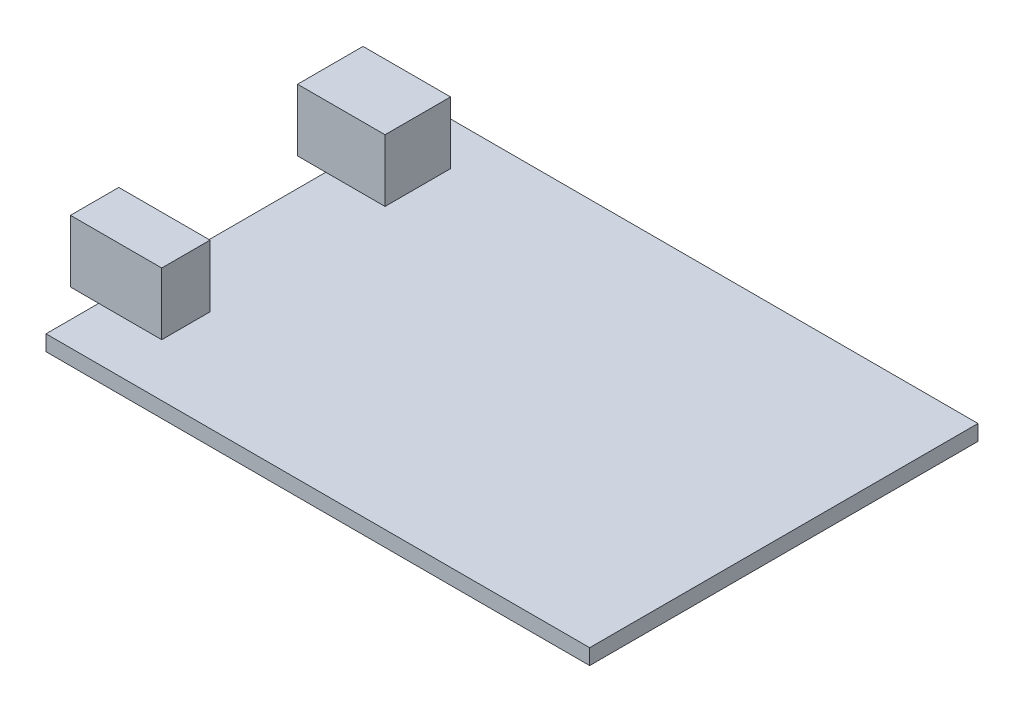
ISO-10303-21;
HEADER;
FILE_DESCRIPTION(('STEP AP214'),'2;1');
FILE_NAME('part.step','',(''),(''),'','','');
FILE_SCHEMA(('AUTOMOTIVE_DESIGN { 1 0 10303 214 1 1 1 1 }'));
ENDSEC;
DATA;
#1=APPLICATION_CONTEXT('core data for automotive mechanical design processes');
#2=APPLICATION_PROTOCOL_DEFINITION('international standard','automotive_design',2000,#1);
#3=PRODUCT_CONTEXT('',#1,'mechanical');
#4=PRODUCT('Part','Part','',(#3));
#5=PRODUCT_RELATED_PRODUCT_CATEGORY('part','',(#4));
#6=PRODUCT_DEFINITION_FORMATION('','',#4);
#7=PRODUCT_DEFINITION_CONTEXT('part definition',#1,'design');
#8=PRODUCT_DEFINITION('design','',#6,#7);
#9=PRODUCT_DEFINITION_SHAPE('','',#8);
#10=(LENGTH_UNIT() NAMED_UNIT(*) SI_UNIT(.MILLI.,.METRE.));
#11=(NAMED_UNIT(*) PLANE_ANGLE_UNIT() SI_UNIT($,.RADIAN.));
#12=(NAMED_UNIT(*) SI_UNIT($,.STERADIAN.) SOLID_ANGLE_UNIT());
#13=UNCERTAINTY_MEASURE_WITH_UNIT(LENGTH_MEASURE(1.E-05),#10,'distance_accuracy_value','');
#14=(GEOMETRIC_REPRESENTATION_CONTEXT(3) GLOBAL_UNCERTAINTY_ASSIGNED_CONTEXT((#13)) GLOBAL_UNIT_ASSIGNED_CONTEXT((#10,
#11,#12)) REPRESENTATION_CONTEXT('',''));
#15=CARTESIAN_POINT('',(0.,0.,0.));
#16=DIRECTION('',(0.,0.,1.));
#17=DIRECTION('',(1.,0.,0.));
#18=AXIS2_PLACEMENT_3D('',#15,#16,#17);
#19=CARTESIAN_POINT('',(0.,2.,0.));
#20=DIRECTION('',(0.,1.,0.));
#21=DIRECTION('',(0.,0.,1.));
#22=AXIS2_PLACEMENT_3D('',#19,#20,#21);
#23=PLANE('',#22);
#24=DIRECTION('',(0.,0.,-1.));
#25=VECTOR('',#24,1.);
#26=CARTESIAN_POINT('',(-14.1859712994656,2.,27.3935905930048));
#27=LINE('',#26,#25);
#28=CARTESIAN_POINT('',(-14.1859712994656,2.,33.6141875318112));
#29=VERTEX_POINT('',#28);
#30=CARTESIAN_POINT('',(-14.1859712994656,2.,27.3935905930048));
#31=VERTEX_POINT('',#30);
#32=EDGE_CURVE('E312',#29,#31,#27,.T.);
#33=ORIENTED_EDGE('',*,*,#32,.F.);
#34=DIRECTION('',(-1.,0.,0.));
#35=VECTOR('',#34,1.);
#36=CARTESIAN_POINT('',(0.,2.,33.6141875318112));
#37=LINE('',#36,#35);
#38=CARTESIAN_POINT('',(-22.2991689750693,2.,33.6141875318112));
#39=VERTEX_POINT('',#38);
#40=EDGE_CURVE('E11',#29,#39,#37,.T.);
#41=ORIENTED_EDGE('',*,*,#40,.T.);
#42=DIRECTION('',(0.,0.,1.));
#43=VECTOR('',#42,1.);
#44=CARTESIAN_POINT('',(-22.2991689750693,2.,-9.59833795013851));
#45=LINE('',#44,#43);
#46=CARTESIAN_POINT('',(-22.2991689750693,2.,40.4016620498615));
#47=VERTEX_POINT('',#46);
#48=EDGE_CURVE('E387',#39,#47,#45,.T.);
#49=ORIENTED_EDGE('',*,*,#48,.T.);
#50=DIRECTION('',(1.,0.,0.));
#51=VECTOR('',#50,1.);
#52=CARTESIAN_POINT('',(-22.2991689750693,2.,40.4016620498615));
#53=LINE('',#52,#51);
#54=CARTESIAN_POINT('',(47.7008310249307,2.,40.4016620498615));
#55=VERTEX_POINT('',#54);
#56=EDGE_CURVE('E385',#47,#55,#53,.T.);
#57=ORIENTED_EDGE('',*,*,#56,.T.);
#58=DIRECTION('',(0.,0.,-1.));
#59=VECTOR('',#58,1.);
#60=CARTESIAN_POINT('',(47.7008310249307,2.,-9.59833795013851));
#61=LINE('',#60,#59);
#62=CARTESIAN_POINT('',(47.7008310249307,2.,-9.59833795013851));
#63=VERTEX_POINT('',#62);
#64=EDGE_CURVE('E390',#55,#63,#61,.T.);
#65=ORIENTED_EDGE('',*,*,#64,.T.);
#66=DIRECTION('',(-1.,0.,0.));
#67=VECTOR('',#66,1.);
#68=CARTESIAN_POINT('',(-22.2991689750693,2.,-9.59833795013851));
#69=LINE('',#68,#67);
#70=CARTESIAN_POINT('',(-22.2991689750693,2.,-9.59833795013851));
#71=VERTEX_POINT('',#70);
#72=EDGE_CURVE('E393',#63,#71,#69,.T.);
#73=ORIENTED_EDGE('',*,*,#72,.T.);
#74=CARTESIAN_POINT('',(-22.2991689750693,2.,-4.05498281984949));
#75=VERTEX_POINT('',#74);
#76=EDGE_CURVE('E381',#71,#75,#45,.T.);
#77=ORIENTED_EDGE('',*,*,#76,.T.);
#78=DIRECTION('',(-1.,0.,0.));
#79=VECTOR('',#78,1.);
#80=CARTESIAN_POINT('',(-25.9359877394331,2.,-4.05498281984949));
#81=LINE('',#80,#79);
#82=CARTESIAN_POINT('',(-14.6697955058172,2.,-4.05498281984949));
#83=VERTEX_POINT('',#82);
#84=EDGE_CURVE('E340',#83,#75,#81,.T.);
#85=ORIENTED_EDGE('',*,*,#84,.F.);
#86=DIRECTION('',(0.,0.,-1.));
#87=VECTOR('',#86,1.);
#88=CARTESIAN_POINT('',(-14.6697955058172,2.,-4.05498281984949));
#89=LINE('',#88,#87);
#90=CARTESIAN_POINT('',(-14.6697955058172,2.,4.37738191942134));
#91=VERTEX_POINT('',#90);
#92=EDGE_CURVE('E357',#91,#83,#89,.T.);
#93=ORIENTED_EDGE('',*,*,#92,.F.);
#94=DIRECTION('',(1.,0.,0.));
#95=VECTOR('',#94,1.);
#96=CARTESIAN_POINT('',(-25.9359877394331,2.,4.37738191942134));
#97=LINE('',#96,#95);
#98=CARTESIAN_POINT('',(-22.2991689750693,2.,4.37738191942134));
#99=VERTEX_POINT('',#98);
#100=EDGE_CURVE('E48',#99,#91,#97,.T.);
#101=ORIENTED_EDGE('',*,*,#100,.F.);
#102=CARTESIAN_POINT('',(-22.2991689750693,2.,27.3935905930048));
#103=VERTEX_POINT('',#102);
#104=EDGE_CURVE('E453',#99,#103,#45,.T.);
#105=ORIENTED_EDGE('',*,*,#104,.T.);
#106=DIRECTION('',(-1.,0.,0.));
#107=VECTOR('',#106,1.);
#108=CARTESIAN_POINT('',(-25.9359877394331,2.,27.3935905930048));
#109=LINE('',#108,#107);
#110=EDGE_CURVE('E295',#31,#103,#109,.T.);
#111=ORIENTED_EDGE('',*,*,#110,.F.);
#112=EDGE_LOOP('',(#33,#41,#49,#57,#65,#73,#77,#85,#93,#101,#105,#111));
#113=FACE_BOUND('',#112,.T.);
#114=ADVANCED_FACE('F39',(#113),#23,.T.);
#115=CARTESIAN_POINT('',(-22.2991689750693,2.,-9.59833795013851));
#116=DIRECTION('',(1.,0.,0.));
#117=DIRECTION('',(0.,0.,-1.));
#118=AXIS2_PLACEMENT_3D('',#115,#116,#117);
#119=PLANE('',#118);
#120=DIRECTION('',(0.,0.,1.));
#121=VECTOR('',#120,1.);
#122=CARTESIAN_POINT('',(-22.2991689750693,0.,-9.59833795013851));
#123=LINE('',#122,#121);
#124=CARTESIAN_POINT('',(-22.2991689750693,0.,-9.59833795013851));
#125=VERTEX_POINT('',#124);
#126=CARTESIAN_POINT('',(-22.2991689750693,0.,40.4016620498615));
#127=VERTEX_POINT('',#126);
#128=EDGE_CURVE('E380',#125,#127,#123,.T.);
#129=ORIENTED_EDGE('',*,*,#128,.T.);
#130=DIRECTION('',(0.,-1.,0.));
#131=VECTOR('',#130,1.);
#132=CARTESIAN_POINT('',(-22.2991689750693,2.,40.4016620498615));
#133=LINE('',#132,#131);
#134=EDGE_CURVE('E419',#47,#127,#133,.T.);
#135=ORIENTED_EDGE('',*,*,#134,.F.);
#136=ORIENTED_EDGE('',*,*,#48,.F.);
#137=EDGE_CURVE('E455',#103,#39,#45,.T.);
#138=ORIENTED_EDGE('',*,*,#137,.F.);
#139=ORIENTED_EDGE('',*,*,#104,.F.);
#140=EDGE_CURVE('E386',#75,#99,#45,.T.);
#141=ORIENTED_EDGE('',*,*,#140,.F.);
#142=ORIENTED_EDGE('',*,*,#76,.F.);
#143=DIRECTION('',(0.,-1.,0.));
#144=VECTOR('',#143,1.);
#145=CARTESIAN_POINT('',(-22.2991689750693,2.,-9.59833795013851));
#146=LINE('',#145,#144);
#147=EDGE_CURVE('E396',#71,#125,#146,.T.);
#148=ORIENTED_EDGE('',*,*,#147,.T.);
#149=EDGE_LOOP('',(#129,#135,#136,#138,#139,#141,#142,#148));
#150=FACE_BOUND('',#149,.T.);
#151=ADVANCED_FACE('F41',(#150),#119,.F.);
#152=CARTESIAN_POINT('',(-22.2991689750693,2.,40.4016620498615));
#153=DIRECTION('',(0.,0.,-1.));
#154=DIRECTION('',(-1.,0.,0.));
#155=AXIS2_PLACEMENT_3D('',#152,#153,#154);
#156=PLANE('',#155);
#157=DIRECTION('',(1.,0.,0.));
#158=VECTOR('',#157,1.);
#159=CARTESIAN_POINT('',(-22.2991689750693,0.,40.4016620498615));
#160=LINE('',#159,#158);
#161=CARTESIAN_POINT('',(47.7008310249307,0.,40.4016620498615));
#162=VERTEX_POINT('',#161);
#163=EDGE_CURVE('E400',#127,#162,#160,.T.);
#164=ORIENTED_EDGE('',*,*,#163,.T.);
#165=DIRECTION('',(0.,-1.,0.));
#166=VECTOR('',#165,1.);
#167=CARTESIAN_POINT('',(47.7008310249307,2.,40.4016620498615));
#168=LINE('',#167,#166);
#169=EDGE_CURVE('E416',#55,#162,#168,.T.);
#170=ORIENTED_EDGE('',*,*,#169,.F.);
#171=ORIENTED_EDGE('',*,*,#56,.F.);
#172=ORIENTED_EDGE('',*,*,#134,.T.);
#173=EDGE_LOOP('',(#164,#170,#171,#172));
#174=FACE_BOUND('',#173,.T.);
#175=ADVANCED_FACE('F464',(#174),#156,.F.);
#176=CARTESIAN_POINT('',(47.7008310249307,2.,-9.59833795013851));
#177=DIRECTION('',(-1.,0.,0.));
#178=DIRECTION('',(0.,0.,1.));
#179=AXIS2_PLACEMENT_3D('',#176,#177,#178);
#180=PLANE('',#179);
#181=DIRECTION('',(0.,0.,-1.));
#182=VECTOR('',#181,1.);
#183=CARTESIAN_POINT('',(47.7008310249307,0.,-9.59833795013851));
#184=LINE('',#183,#182);
#185=CARTESIAN_POINT('',(47.7008310249307,0.,-9.59833795013851));
#186=VERTEX_POINT('',#185);
#187=EDGE_CURVE('E403',#162,#186,#184,.T.);
#188=ORIENTED_EDGE('',*,*,#187,.T.);
#189=DIRECTION('',(0.,-1.,0.));
#190=VECTOR('',#189,1.);
#191=CARTESIAN_POINT('',(47.7008310249307,2.,-9.59833795013851));
#192=LINE('',#191,#190);
#193=EDGE_CURVE('E412',#63,#186,#192,.T.);
#194=ORIENTED_EDGE('',*,*,#193,.F.);
#195=ORIENTED_EDGE('',*,*,#64,.F.);
#196=ORIENTED_EDGE('',*,*,#169,.T.);
#197=EDGE_LOOP('',(#188,#194,#195,#196));
#198=FACE_BOUND('',#197,.T.);
#199=ADVANCED_FACE('F473',(#198),#180,.F.);
#200=CARTESIAN_POINT('',(-22.2991689750693,2.,-9.59833795013851));
#201=DIRECTION('',(0.,0.,1.));
#202=DIRECTION('',(1.,0.,0.));
#203=AXIS2_PLACEMENT_3D('',#200,#201,#202);
#204=PLANE('',#203);
#205=DIRECTION('',(-1.,0.,0.));
#206=VECTOR('',#205,1.);
#207=CARTESIAN_POINT('',(-22.2991689750693,0.,-9.59833795013851));
#208=LINE('',#207,#206);
#209=EDGE_CURVE('E406',#186,#125,#208,.T.);
#210=ORIENTED_EDGE('',*,*,#209,.T.);
#211=ORIENTED_EDGE('',*,*,#147,.F.);
#212=ORIENTED_EDGE('',*,*,#72,.F.);
#213=ORIENTED_EDGE('',*,*,#193,.T.);
#214=EDGE_LOOP('',(#210,#211,#212,#213));
#215=FACE_BOUND('',#214,.T.);
#216=ADVANCED_FACE('F477',(#215),#204,.F.);
#217=CARTESIAN_POINT('',(0.,0.,0.));
#218=DIRECTION('',(0.,1.,0.));
#219=DIRECTION('',(0.,0.,1.));
#220=AXIS2_PLACEMENT_3D('',#217,#218,#219);
#221=PLANE('',#220);
#222=ORIENTED_EDGE('',*,*,#128,.F.);
#223=ORIENTED_EDGE('',*,*,#209,.F.);
#224=ORIENTED_EDGE('',*,*,#187,.F.);
#225=ORIENTED_EDGE('',*,*,#163,.F.);
#226=EDGE_LOOP('',(#222,#223,#224,#225));
#227=FACE_BOUND('',#226,.T.);
#228=ADVANCED_FACE('F470',(#227),#221,.F.);
#229=CARTESIAN_POINT('',(0.,2.,0.));
#230=DIRECTION('',(0.,1.,0.));
#231=DIRECTION('',(0.,0.,1.));
#232=AXIS2_PLACEMENT_3D('',#229,#230,#231);
#233=PLANE('',#232);
#234=CARTESIAN_POINT('',(-25.9359877394331,2.,-4.05498281984949));
#235=VERTEX_POINT('',#234);
#236=EDGE_CURVE('E361',#75,#235,#81,.T.);
#237=ORIENTED_EDGE('',*,*,#236,.F.);
#238=ORIENTED_EDGE('',*,*,#140,.T.);
#239=CARTESIAN_POINT('',(-25.9359877394331,2.,4.37738191942134));
#240=VERTEX_POINT('',#239);
#241=EDGE_CURVE('E353',#240,#99,#97,.T.);
#242=ORIENTED_EDGE('',*,*,#241,.F.);
#243=DIRECTION('',(0.,0.,1.));
#244=VECTOR('',#243,1.);
#245=CARTESIAN_POINT('',(-25.9359877394331,2.,-4.05498281984949));
#246=LINE('',#245,#244);
#247=EDGE_CURVE('E334',#235,#240,#246,.T.);
#248=ORIENTED_EDGE('',*,*,#247,.F.);
#249=EDGE_LOOP('',(#237,#238,#242,#248));
#250=FACE_BOUND('',#249,.T.);
#251=ADVANCED_FACE('F448',(#250),#233,.F.);
#252=CARTESIAN_POINT('',(-25.9359877394331,10.,-4.05498281984949));
#253=DIRECTION('',(1.,0.,0.));
#254=DIRECTION('',(0.,0.,-1.));
#255=AXIS2_PLACEMENT_3D('',#252,#253,#254);
#256=PLANE('',#255);
#257=DIRECTION('',(0.,0.,1.));
#258=VECTOR('',#257,1.);
#259=CARTESIAN_POINT('',(-25.9359877394331,6.72634302600983,-2.56591012597696));
#260=LINE('',#259,#258);
#261=CARTESIAN_POINT('',(-25.9359877394331,6.72634302600983,-2.56591012597696));
#262=VERTEX_POINT('',#261);
#263=CARTESIAN_POINT('',(-25.9359877394331,6.72634302600983,3.40255310465132));
#264=VERTEX_POINT('',#263);
#265=EDGE_CURVE('E225',#262,#264,#260,.T.);
#266=ORIENTED_EDGE('',*,*,#265,.F.);
#267=DIRECTION('',(0.,-1.,0.));
#268=VECTOR('',#267,1.);
#269=CARTESIAN_POINT('',(-25.9359877394331,6.72634302600983,-2.56591012597696));
#270=LINE('',#269,#268);
#271=CARTESIAN_POINT('',(-25.9359877394331,8.4983750083083,-2.56591012597696));
#272=VERTEX_POINT('',#271);
#273=EDGE_CURVE('E55',#272,#262,#270,.T.);
#274=ORIENTED_EDGE('',*,*,#273,.F.);
#275=DIRECTION('',(0.,0.,-1.));
#276=VECTOR('',#275,1.);
#277=CARTESIAN_POINT('',(-25.9359877394331,8.4983750083083,-2.56591012597696));
#278=LINE('',#277,#276);
#279=CARTESIAN_POINT('',(-25.9359877394331,8.4983750083083,3.40255310465132));
#280=VERTEX_POINT('',#279);
#281=EDGE_CURVE('E212',#280,#272,#278,.T.);
#282=ORIENTED_EDGE('',*,*,#281,.F.);
#283=DIRECTION('',(0.,1.,0.));
#284=VECTOR('',#283,1.);
#285=CARTESIAN_POINT('',(-25.9359877394331,6.72634302600983,3.40255310465132));
#286=LINE('',#285,#284);
#287=EDGE_CURVE('E216',#264,#280,#286,.T.);
#288=ORIENTED_EDGE('',*,*,#287,.F.);
#289=EDGE_LOOP('',(#266,#274,#282,#288));
#290=FACE_BOUND('',#289,.T.);
#291=DIRECTION('',(0.,0.,1.));
#292=VECTOR('',#291,1.);
#293=CARTESIAN_POINT('',(-25.9359877394331,3.59236327771129,-2.56591012597696));
#294=LINE('',#293,#292);
#295=CARTESIAN_POINT('',(-25.9359877394331,3.59236327771129,-2.56591012597696));
#296=VERTEX_POINT('',#295);
#297=CARTESIAN_POINT('',(-25.9359877394331,3.59236327771129,3.40255310465132));
#298=VERTEX_POINT('',#297);
#299=EDGE_CURVE('E267',#296,#298,#294,.T.);
#300=ORIENTED_EDGE('',*,*,#299,.F.);
#301=DIRECTION('',(0.,-1.,0.));
#302=VECTOR('',#301,1.);
#303=CARTESIAN_POINT('',(-25.9359877394331,3.59236327771129,-2.56591012597696));
#304=LINE('',#303,#302);
#305=CARTESIAN_POINT('',(-25.9359877394331,5.55405328059067,-2.56591012597696));
#306=VERTEX_POINT('',#305);
#307=EDGE_CURVE('E63',#306,#296,#304,.T.);
#308=ORIENTED_EDGE('',*,*,#307,.F.);
#309=DIRECTION('',(0.,0.,-1.));
#310=VECTOR('',#309,1.);
#311=CARTESIAN_POINT('',(-25.9359877394331,5.55405328059067,-2.56591012597696));
#312=LINE('',#311,#310);
#313=CARTESIAN_POINT('',(-25.9359877394331,5.55405328059067,3.40255310465132));
#314=VERTEX_POINT('',#313);
#315=EDGE_CURVE('E252',#314,#306,#312,.T.);
#316=ORIENTED_EDGE('',*,*,#315,.F.);
#317=DIRECTION('',(0.,1.,0.));
#318=VECTOR('',#317,1.);
#319=CARTESIAN_POINT('',(-25.9359877394331,3.59236327771129,3.40255310465132));
#320=LINE('',#319,#318);
#321=EDGE_CURVE('E271',#298,#314,#320,.T.);
#322=ORIENTED_EDGE('',*,*,#321,.F.);
#323=EDGE_LOOP('',(#300,#308,#316,#322));
#324=FACE_BOUND('',#323,.T.);
#325=ORIENTED_EDGE('',*,*,#247,.T.);
#326=DIRECTION('',(0.,-1.,0.));
#327=VECTOR('',#326,1.);
#328=CARTESIAN_POINT('',(-25.9359877394331,10.,4.37738191942134));
#329=LINE('',#328,#327);
#330=CARTESIAN_POINT('',(-25.9359877394331,10.,4.37738191942134));
#331=VERTEX_POINT('',#330);
#332=EDGE_CURVE('E376',#331,#240,#329,.T.);
#333=ORIENTED_EDGE('',*,*,#332,.F.);
#334=DIRECTION('',(0.,0.,1.));
#335=VECTOR('',#334,1.);
#336=CARTESIAN_POINT('',(-25.9359877394331,10.,-4.05498281984949));
#337=LINE('',#336,#335);
#338=CARTESIAN_POINT('',(-25.9359877394331,10.,-4.05498281984949));
#339=VERTEX_POINT('',#338);
#340=EDGE_CURVE('E335',#339,#331,#337,.T.);
#341=ORIENTED_EDGE('',*,*,#340,.F.);
#342=DIRECTION('',(0.,-1.,0.));
#343=VECTOR('',#342,1.);
#344=CARTESIAN_POINT('',(-25.9359877394331,10.,-4.05498281984949));
#345=LINE('',#344,#343);
#346=EDGE_CURVE('E349',#339,#235,#345,.T.);
#347=ORIENTED_EDGE('',*,*,#346,.T.);
#348=EDGE_LOOP('',(#325,#333,#341,#347));
#349=FACE_BOUND('',#348,.T.);
#350=ADVANCED_FACE('F445',(#290,#324,#349),#256,.F.);
#351=CARTESIAN_POINT('',(-25.9359877394331,10.,4.37738191942134));
#352=DIRECTION('',(0.,0.,-1.));
#353=DIRECTION('',(-1.,0.,0.));
#354=AXIS2_PLACEMENT_3D('',#351,#352,#353);
#355=PLANE('',#354);
#356=ORIENTED_EDGE('',*,*,#241,.T.);
#357=ORIENTED_EDGE('',*,*,#100,.T.);
#358=DIRECTION('',(0.,-1.,0.));
#359=VECTOR('',#358,1.);
#360=CARTESIAN_POINT('',(-14.6697955058172,10.,4.37738191942134));
#361=LINE('',#360,#359);
#362=CARTESIAN_POINT('',(-14.6697955058172,10.,4.37738191942134));
#363=VERTEX_POINT('',#362);
#364=EDGE_CURVE('E372',#363,#91,#361,.T.);
#365=ORIENTED_EDGE('',*,*,#364,.F.);
#366=DIRECTION('',(1.,0.,0.));
#367=VECTOR('',#366,1.);
#368=CARTESIAN_POINT('',(-25.9359877394331,10.,4.37738191942134));
#369=LINE('',#368,#367);
#370=EDGE_CURVE('E339',#331,#363,#369,.T.);
#371=ORIENTED_EDGE('',*,*,#370,.F.);
#372=ORIENTED_EDGE('',*,*,#332,.T.);
#373=EDGE_LOOP('',(#356,#357,#365,#371,#372));
#374=FACE_BOUND('',#373,.T.);
#375=ADVANCED_FACE('F429',(#374),#355,.F.);
#376=CARTESIAN_POINT('',(-14.6697955058172,10.,-4.05498281984949));
#377=DIRECTION('',(-1.,0.,0.));
#378=DIRECTION('',(0.,0.,1.));
#379=AXIS2_PLACEMENT_3D('',#376,#377,#378);
#380=PLANE('',#379);
#381=ORIENTED_EDGE('',*,*,#92,.T.);
#382=DIRECTION('',(0.,-1.,0.));
#383=VECTOR('',#382,1.);
#384=CARTESIAN_POINT('',(-14.6697955058172,10.,-4.05498281984949));
#385=LINE('',#384,#383);
#386=CARTESIAN_POINT('',(-14.6697955058172,10.,-4.05498281984949));
#387=VERTEX_POINT('',#386);
#388=EDGE_CURVE('E368',#387,#83,#385,.T.);
#389=ORIENTED_EDGE('',*,*,#388,.F.);
#390=DIRECTION('',(0.,0.,-1.));
#391=VECTOR('',#390,1.);
#392=CARTESIAN_POINT('',(-14.6697955058172,10.,-4.05498281984949));
#393=LINE('',#392,#391);
#394=EDGE_CURVE('E343',#363,#387,#393,.T.);
#395=ORIENTED_EDGE('',*,*,#394,.F.);
#396=ORIENTED_EDGE('',*,*,#364,.T.);
#397=EDGE_LOOP('',(#381,#389,#395,#396));
#398=FACE_BOUND('',#397,.T.);
#399=ADVANCED_FACE('F435',(#398),#380,.F.);
#400=CARTESIAN_POINT('',(-25.9359877394331,10.,-4.05498281984949));
#401=DIRECTION('',(0.,0.,1.));
#402=DIRECTION('',(1.,0.,0.));
#403=AXIS2_PLACEMENT_3D('',#400,#401,#402);
#404=PLANE('',#403);
#405=ORIENTED_EDGE('',*,*,#84,.T.);
#406=ORIENTED_EDGE('',*,*,#236,.T.);
#407=ORIENTED_EDGE('',*,*,#346,.F.);
#408=DIRECTION('',(-1.,0.,0.));
#409=VECTOR('',#408,1.);
#410=CARTESIAN_POINT('',(-25.9359877394331,10.,-4.05498281984949));
#411=LINE('',#410,#409);
#412=EDGE_CURVE('E346',#387,#339,#411,.T.);
#413=ORIENTED_EDGE('',*,*,#412,.F.);
#414=ORIENTED_EDGE('',*,*,#388,.T.);
#415=EDGE_LOOP('',(#405,#406,#407,#413,#414));
#416=FACE_BOUND('',#415,.T.);
#417=ADVANCED_FACE('F500',(#416),#404,.F.);
#418=CARTESIAN_POINT('',(0.,10.,0.));
#419=DIRECTION('',(0.,1.,0.));
#420=DIRECTION('',(0.,0.,1.));
#421=AXIS2_PLACEMENT_3D('',#418,#419,#420);
#422=PLANE('',#421);
#423=ORIENTED_EDGE('',*,*,#340,.T.);
#424=ORIENTED_EDGE('',*,*,#370,.T.);
#425=ORIENTED_EDGE('',*,*,#394,.T.);
#426=ORIENTED_EDGE('',*,*,#412,.T.);
#427=EDGE_LOOP('',(#423,#424,#425,#426));
#428=FACE_BOUND('',#427,.T.);
#429=ADVANCED_FACE('F439',(#428),#422,.T.);
#430=CARTESIAN_POINT('',(0.,2.,0.));
#431=DIRECTION('',(0.,1.,0.));
#432=DIRECTION('',(0.,0.,1.));
#433=AXIS2_PLACEMENT_3D('',#430,#431,#432);
#434=PLANE('',#433);
#435=CARTESIAN_POINT('',(-25.9359877394331,2.,27.3935905930048));
#436=VERTEX_POINT('',#435);
#437=EDGE_CURVE('E316',#103,#436,#109,.T.);
#438=ORIENTED_EDGE('',*,*,#437,.F.);
#439=ORIENTED_EDGE('',*,*,#137,.T.);
#440=DIRECTION('',(1.,0.,0.));
#441=VECTOR('',#440,1.);
#442=CARTESIAN_POINT('',(-25.9359877394331,2.,33.6141875318112));
#443=LINE('',#442,#441);
#444=CARTESIAN_POINT('',(-25.9359877394331,2.,33.6141875318112));
#445=VERTEX_POINT('',#444);
#446=EDGE_CURVE('E308',#445,#39,#443,.T.);
#447=ORIENTED_EDGE('',*,*,#446,.F.);
#448=DIRECTION('',(0.,0.,1.));
#449=VECTOR('',#448,1.);
#450=CARTESIAN_POINT('',(-25.9359877394331,2.,27.3935905930048));
#451=LINE('',#450,#449);
#452=EDGE_CURVE('E281',#436,#445,#451,.T.);
#453=ORIENTED_EDGE('',*,*,#452,.F.);
#454=EDGE_LOOP('',(#438,#439,#447,#453));
#455=FACE_BOUND('',#454,.T.);
#456=ADVANCED_FACE('F508',(#455),#434,.F.);
#457=CARTESIAN_POINT('',(-25.9359877394331,10.,27.3935905930048));
#458=DIRECTION('',(1.,0.,0.));
#459=DIRECTION('',(0.,0.,-1.));
#460=AXIS2_PLACEMENT_3D('',#457,#458,#459);
#461=PLANE('',#460);
#462=CARTESIAN_POINT('',(-25.9359877394331,5.55405328059067,30.5003001079012));
#463=DIRECTION('',(-1.,0.,0.));
#464=DIRECTION('',(0.,0.,1.));
#465=AXIS2_PLACEMENT_3D('',#462,#463,#464);
#466=CIRCLE('',#465,2.07325927731412);
#467=CARTESIAN_POINT('',(-25.9359877394331,5.55405328059067,32.5735593852153));
#468=VERTEX_POINT('',#467);
#469=EDGE_CURVE('E243',#468,#468,#466,.T.);
#470=ORIENTED_EDGE('',*,*,#469,.F.);
#471=EDGE_LOOP('',(#470));
#472=FACE_BOUND('',#471,.T.);
#473=ORIENTED_EDGE('',*,*,#452,.T.);
#474=DIRECTION('',(0.,-1.,0.));
#475=VECTOR('',#474,1.);
#476=CARTESIAN_POINT('',(-25.9359877394331,10.,33.6141875318112));
#477=LINE('',#476,#475);
#478=CARTESIAN_POINT('',(-25.9359877394331,10.,33.6141875318112));
#479=VERTEX_POINT('',#478);
#480=EDGE_CURVE('E330',#479,#445,#477,.T.);
#481=ORIENTED_EDGE('',*,*,#480,.F.);
#482=DIRECTION('',(0.,0.,1.));
#483=VECTOR('',#482,1.);
#484=CARTESIAN_POINT('',(-25.9359877394331,10.,27.3935905930048));
#485=LINE('',#484,#483);
#486=CARTESIAN_POINT('',(-25.9359877394331,10.,27.3935905930048));
#487=VERTEX_POINT('',#486);
#488=EDGE_CURVE('E290',#487,#479,#485,.T.);
#489=ORIENTED_EDGE('',*,*,#488,.F.);
#490=DIRECTION('',(0.,-1.,0.));
#491=VECTOR('',#490,1.);
#492=CARTESIAN_POINT('',(-25.9359877394331,10.,27.3935905930048));
#493=LINE('',#492,#491);
#494=EDGE_CURVE('E304',#487,#436,#493,.T.);
#495=ORIENTED_EDGE('',*,*,#494,.T.);
#496=EDGE_LOOP('',(#473,#481,#489,#495));
#497=FACE_BOUND('',#496,.T.);
#498=ADVANCED_FACE('F509',(#472,#497),#461,.F.);
#499=CARTESIAN_POINT('',(-25.9359877394331,10.,33.6141875318112));
#500=DIRECTION('',(0.,0.,-1.));
#501=DIRECTION('',(-1.,0.,0.));
#502=AXIS2_PLACEMENT_3D('',#499,#500,#501);
#503=PLANE('',#502);
#504=ORIENTED_EDGE('',*,*,#446,.T.);
#505=ORIENTED_EDGE('',*,*,#40,.F.);
#506=DIRECTION('',(0.,-1.,0.));
#507=VECTOR('',#506,1.);
#508=CARTESIAN_POINT('',(-14.1859712994656,10.,33.6141875318112));
#509=LINE('',#508,#507);
#510=CARTESIAN_POINT('',(-14.1859712994656,10.,33.6141875318112));
#511=VERTEX_POINT('',#510);
#512=EDGE_CURVE('E326',#511,#29,#509,.T.);
#513=ORIENTED_EDGE('',*,*,#512,.F.);
#514=DIRECTION('',(1.,0.,0.));
#515=VECTOR('',#514,1.);
#516=CARTESIAN_POINT('',(-25.9359877394331,10.,33.6141875318112));
#517=LINE('',#516,#515);
#518=EDGE_CURVE('E294',#479,#511,#517,.T.);
#519=ORIENTED_EDGE('',*,*,#518,.F.);
#520=ORIENTED_EDGE('',*,*,#480,.T.);
#521=EDGE_LOOP('',(#504,#505,#513,#519,#520));
#522=FACE_BOUND('',#521,.T.);
#523=ADVANCED_FACE('F512',(#522),#503,.F.);
#524=CARTESIAN_POINT('',(-14.1859712994656,10.,27.3935905930048));
#525=DIRECTION('',(-1.,0.,0.));
#526=DIRECTION('',(0.,0.,1.));
#527=AXIS2_PLACEMENT_3D('',#524,#525,#526);
#528=PLANE('',#527);
#529=ORIENTED_EDGE('',*,*,#32,.T.);
#530=DIRECTION('',(0.,-1.,0.));
#531=VECTOR('',#530,1.);
#532=CARTESIAN_POINT('',(-14.1859712994656,10.,27.3935905930048));
#533=LINE('',#532,#531);
#534=CARTESIAN_POINT('',(-14.1859712994656,10.,27.3935905930048));
#535=VERTEX_POINT('',#534);
#536=EDGE_CURVE('E323',#535,#31,#533,.T.);
#537=ORIENTED_EDGE('',*,*,#536,.F.);
#538=DIRECTION('',(0.,0.,-1.));
#539=VECTOR('',#538,1.);
#540=CARTESIAN_POINT('',(-14.1859712994656,10.,27.3935905930048));
#541=LINE('',#540,#539);
#542=EDGE_CURVE('E298',#511,#535,#541,.T.);
#543=ORIENTED_EDGE('',*,*,#542,.F.);
#544=ORIENTED_EDGE('',*,*,#512,.T.);
#545=EDGE_LOOP('',(#529,#537,#543,#544));
#546=FACE_BOUND('',#545,.T.);
#547=ADVANCED_FACE('F516',(#546),#528,.F.);
#548=CARTESIAN_POINT('',(-25.9359877394331,10.,27.3935905930048));
#549=DIRECTION('',(0.,0.,1.));
#550=DIRECTION('',(1.,0.,0.));
#551=AXIS2_PLACEMENT_3D('',#548,#549,#550);
#552=PLANE('',#551);
#553=ORIENTED_EDGE('',*,*,#110,.T.);
#554=ORIENTED_EDGE('',*,*,#437,.T.);
#555=ORIENTED_EDGE('',*,*,#494,.F.);
#556=DIRECTION('',(-1.,0.,0.));
#557=VECTOR('',#556,1.);
#558=CARTESIAN_POINT('',(-25.9359877394331,10.,27.3935905930048));
#559=LINE('',#558,#557);
#560=EDGE_CURVE('E301',#535,#487,#559,.T.);
#561=ORIENTED_EDGE('',*,*,#560,.F.);
#562=ORIENTED_EDGE('',*,*,#536,.T.);
#563=EDGE_LOOP('',(#553,#554,#555,#561,#562));
#564=FACE_BOUND('',#563,.T.);
#565=ADVANCED_FACE('F520',(#564),#552,.F.);
#566=CARTESIAN_POINT('',(0.,10.,0.));
#567=DIRECTION('',(0.,1.,0.));
#568=DIRECTION('',(0.,0.,1.));
#569=AXIS2_PLACEMENT_3D('',#566,#567,#568);
#570=PLANE('',#569);
#571=ORIENTED_EDGE('',*,*,#488,.T.);
#572=ORIENTED_EDGE('',*,*,#518,.T.);
#573=ORIENTED_EDGE('',*,*,#542,.T.);
#574=ORIENTED_EDGE('',*,*,#560,.T.);
#575=EDGE_LOOP('',(#571,#572,#573,#574));
#576=FACE_BOUND('',#575,.T.);
#577=ADVANCED_FACE('F524',(#576),#570,.T.);
#578=CARTESIAN_POINT('',(-17.9359877394331,5.55405328059067,30.5003001079012));
#579=DIRECTION('',(-1.,0.,0.));
#580=DIRECTION('',(0.,0.,1.));
#581=AXIS2_PLACEMENT_3D('',#578,#579,#580);
#582=CYLINDRICAL_SURFACE('',#581,2.07325927731412);
#583=CARTESIAN_POINT('',(-17.9359877394331,5.55405328059067,30.5003001079012));
#584=DIRECTION('',(-1.,0.,0.));
#585=DIRECTION('',(0.,0.,1.));
#586=AXIS2_PLACEMENT_3D('',#583,#584,#585);
#587=CIRCLE('',#586,2.07325927731412);
#588=CARTESIAN_POINT('',(-17.9359877394331,5.55405328059067,32.5735593852153));
#589=VERTEX_POINT('',#588);
#590=EDGE_CURVE('E226',#589,#589,#587,.T.);
#591=ORIENTED_EDGE('',*,*,#590,.F.);
#592=EDGE_LOOP('',(#591));
#593=FACE_BOUND('',#592,.T.);
#594=ORIENTED_EDGE('',*,*,#469,.T.);
#595=EDGE_LOOP('',(#594));
#596=FACE_BOUND('',#595,.T.);
#597=ADVANCED_FACE('F530',(#593,#596),#582,.F.);
#598=CARTESIAN_POINT('',(-17.9359877394331,5.55405328059067,30.5003001079012));
#599=DIRECTION('',(-1.,0.,0.));
#600=DIRECTION('',(0.,0.,1.));
#601=AXIS2_PLACEMENT_3D('',#598,#599,#600);
#602=PLANE('',#601);
#603=ORIENTED_EDGE('',*,*,#590,.T.);
#604=EDGE_LOOP('',(#603));
#605=FACE_BOUND('',#604,.T.);
#606=ADVANCED_FACE('F536',(#605),#602,.T.);
#607=CARTESIAN_POINT('',(-17.9359877394331,3.59236327771129,-2.56591012597696));
#608=DIRECTION('',(0.,0.,-1.));
#609=DIRECTION('',(-1.,0.,0.));
#610=AXIS2_PLACEMENT_3D('',#607,#608,#609);
#611=PLANE('',#610);
#612=ORIENTED_EDGE('',*,*,#307,.T.);
#613=DIRECTION('',(-1.,0.,0.));
#614=VECTOR('',#613,1.);
#615=CARTESIAN_POINT('',(-17.9359877394331,3.59236327771129,-2.56591012597696));
#616=LINE('',#615,#614);
#617=CARTESIAN_POINT('',(-17.9359877394331,3.59236327771129,-2.56591012597696));
#618=VERTEX_POINT('',#617);
#619=EDGE_CURVE('E264',#618,#296,#616,.T.);
#620=ORIENTED_EDGE('',*,*,#619,.F.);
#621=DIRECTION('',(0.,-1.,0.));
#622=VECTOR('',#621,1.);
#623=CARTESIAN_POINT('',(-17.9359877394331,3.59236327771129,-2.56591012597696));
#624=LINE('',#623,#622);
#625=CARTESIAN_POINT('',(-17.9359877394331,5.55405328059067,-2.56591012597696));
#626=VERTEX_POINT('',#625);
#627=EDGE_CURVE('E247',#626,#618,#624,.T.);
#628=ORIENTED_EDGE('',*,*,#627,.F.);
#629=DIRECTION('',(-1.,0.,0.));
#630=VECTOR('',#629,1.);
#631=CARTESIAN_POINT('',(-17.9359877394331,5.55405328059067,-2.56591012597696));
#632=LINE('',#631,#630);
#633=EDGE_CURVE('E278',#626,#306,#632,.T.);
#634=ORIENTED_EDGE('',*,*,#633,.T.);
#635=EDGE_LOOP('',(#612,#620,#628,#634));
#636=FACE_BOUND('',#635,.T.);
#637=ADVANCED_FACE('F532',(#636),#611,.F.);
#638=CARTESIAN_POINT('',(-17.9359877394331,5.55405328059067,-2.56591012597696));
#639=DIRECTION('',(0.,1.,0.));
#640=DIRECTION('',(0.,0.,1.));
#641=AXIS2_PLACEMENT_3D('',#638,#639,#640);
#642=PLANE('',#641);
#643=ORIENTED_EDGE('',*,*,#315,.T.);
#644=ORIENTED_EDGE('',*,*,#633,.F.);
#645=DIRECTION('',(0.,0.,-1.));
#646=VECTOR('',#645,1.);
#647=CARTESIAN_POINT('',(-17.9359877394331,5.55405328059067,-2.56591012597696));
#648=LINE('',#647,#646);
#649=CARTESIAN_POINT('',(-17.9359877394331,5.55405328059067,3.40255310465132));
#650=VERTEX_POINT('',#649);
#651=EDGE_CURVE('E260',#650,#626,#648,.T.);
#652=ORIENTED_EDGE('',*,*,#651,.F.);
#653=DIRECTION('',(-1.,0.,0.));
#654=VECTOR('',#653,1.);
#655=CARTESIAN_POINT('',(-17.9359877394331,5.55405328059067,3.40255310465132));
#656=LINE('',#655,#654);
#657=EDGE_CURVE('E282',#650,#314,#656,.T.);
#658=ORIENTED_EDGE('',*,*,#657,.T.);
#659=EDGE_LOOP('',(#643,#644,#652,#658));
#660=FACE_BOUND('',#659,.T.);
#661=ADVANCED_FACE('F535',(#660),#642,.F.);
#662=CARTESIAN_POINT('',(-17.9359877394331,3.59236327771129,3.40255310465132));
#663=DIRECTION('',(0.,0.,1.));
#664=DIRECTION('',(1.,0.,0.));
#665=AXIS2_PLACEMENT_3D('',#662,#663,#664);
#666=PLANE('',#665);
#667=ORIENTED_EDGE('',*,*,#321,.T.);
#668=ORIENTED_EDGE('',*,*,#657,.F.);
#669=DIRECTION('',(0.,1.,0.));
#670=VECTOR('',#669,1.);
#671=CARTESIAN_POINT('',(-17.9359877394331,3.59236327771129,3.40255310465132));
#672=LINE('',#671,#670);
#673=CARTESIAN_POINT('',(-17.9359877394331,3.59236327771129,3.40255310465132));
#674=VERTEX_POINT('',#673);
#675=EDGE_CURVE('E256',#674,#650,#672,.T.);
#676=ORIENTED_EDGE('',*,*,#675,.F.);
#677=DIRECTION('',(-1.,0.,0.));
#678=VECTOR('',#677,1.);
#679=CARTESIAN_POINT('',(-17.9359877394331,3.59236327771129,3.40255310465132));
#680=LINE('',#679,#678);
#681=EDGE_CURVE('E285',#674,#298,#680,.T.);
#682=ORIENTED_EDGE('',*,*,#681,.T.);
#683=EDGE_LOOP('',(#667,#668,#676,#682));
#684=FACE_BOUND('',#683,.T.);
#685=ADVANCED_FACE('F541',(#684),#666,.F.);
#686=CARTESIAN_POINT('',(-17.9359877394331,3.59236327771129,-2.56591012597696));
#687=DIRECTION('',(0.,-1.,0.));
#688=DIRECTION('',(0.,0.,-1.));
#689=AXIS2_PLACEMENT_3D('',#686,#687,#688);
#690=PLANE('',#689);
#691=ORIENTED_EDGE('',*,*,#299,.T.);
#692=ORIENTED_EDGE('',*,*,#681,.F.);
#693=DIRECTION('',(0.,0.,1.));
#694=VECTOR('',#693,1.);
#695=CARTESIAN_POINT('',(-17.9359877394331,3.59236327771129,-2.56591012597696));
#696=LINE('',#695,#694);
#697=EDGE_CURVE('E251',#618,#674,#696,.T.);
#698=ORIENTED_EDGE('',*,*,#697,.F.);
#699=ORIENTED_EDGE('',*,*,#619,.T.);
#700=EDGE_LOOP('',(#691,#692,#698,#699));
#701=FACE_BOUND('',#700,.T.);
#702=ADVANCED_FACE('F537',(#701),#690,.F.);
#703=CARTESIAN_POINT('',(-17.9359877394331,0.,0.));
#704=DIRECTION('',(1.,0.,0.));
#705=DIRECTION('',(0.,0.,-1.));
#706=AXIS2_PLACEMENT_3D('',#703,#704,#705);
#707=PLANE('',#706);
#708=ORIENTED_EDGE('',*,*,#627,.T.);
#709=ORIENTED_EDGE('',*,*,#697,.T.);
#710=ORIENTED_EDGE('',*,*,#675,.T.);
#711=ORIENTED_EDGE('',*,*,#651,.T.);
#712=EDGE_LOOP('',(#708,#709,#710,#711));
#713=FACE_BOUND('',#712,.T.);
#714=ADVANCED_FACE('F540',(#713),#707,.F.);
#715=CARTESIAN_POINT('',(-17.9359877394331,6.72634302600983,-2.56591012597696));
#716=DIRECTION('',(0.,0.,-1.));
#717=DIRECTION('',(-1.,0.,0.));
#718=AXIS2_PLACEMENT_3D('',#715,#716,#717);
#719=PLANE('',#718);
#720=ORIENTED_EDGE('',*,*,#273,.T.);
#721=DIRECTION('',(-1.,0.,0.));
#722=VECTOR('',#721,1.);
#723=CARTESIAN_POINT('',(-17.9359877394331,6.72634302600983,-2.56591012597696));
#724=LINE('',#723,#722);
#725=CARTESIAN_POINT('',(-17.9359877394331,6.72634302600983,-2.56591012597696));
#726=VERTEX_POINT('',#725);
#727=EDGE_CURVE('E187',#726,#262,#724,.T.);
#728=ORIENTED_EDGE('',*,*,#727,.F.);
#729=DIRECTION('',(0.,-1.,0.));
#730=VECTOR('',#729,1.);
#731=CARTESIAN_POINT('',(-17.9359877394331,6.72634302600983,-2.56591012597696));
#732=LINE('',#731,#730);
#733=CARTESIAN_POINT('',(-17.9359877394331,8.4983750083083,-2.56591012597696));
#734=VERTEX_POINT('',#733);
#735=EDGE_CURVE('E191',#734,#726,#732,.T.);
#736=ORIENTED_EDGE('',*,*,#735,.F.);
#737=DIRECTION('',(-1.,0.,0.));
#738=VECTOR('',#737,1.);
#739=CARTESIAN_POINT('',(-17.9359877394331,8.4983750083083,-2.56591012597696));
#740=LINE('',#739,#738);
#741=EDGE_CURVE('E232',#734,#272,#740,.T.);
#742=ORIENTED_EDGE('',*,*,#741,.T.);
#743=EDGE_LOOP('',(#720,#728,#736,#742));
#744=FACE_BOUND('',#743,.T.);
#745=ADVANCED_FACE('F189',(#744),#719,.F.);
#746=CARTESIAN_POINT('',(-17.9359877394331,8.4983750083083,-2.56591012597696));
#747=DIRECTION('',(0.,1.,0.));
#748=DIRECTION('',(0.,0.,1.));
#749=AXIS2_PLACEMENT_3D('',#746,#747,#748);
#750=PLANE('',#749);
#751=ORIENTED_EDGE('',*,*,#281,.T.);
#752=ORIENTED_EDGE('',*,*,#741,.F.);
#753=DIRECTION('',(0.,0.,-1.));
#754=VECTOR('',#753,1.);
#755=CARTESIAN_POINT('',(-17.9359877394331,8.4983750083083,-2.56591012597696));
#756=LINE('',#755,#754);
#757=CARTESIAN_POINT('',(-17.9359877394331,8.4983750083083,3.40255310465132));
#758=VERTEX_POINT('',#757);
#759=EDGE_CURVE('E198',#758,#734,#756,.T.);
#760=ORIENTED_EDGE('',*,*,#759,.F.);
#761=DIRECTION('',(-1.,0.,0.));
#762=VECTOR('',#761,1.);
#763=CARTESIAN_POINT('',(-17.9359877394331,8.4983750083083,3.40255310465132));
#764=LINE('',#763,#762);
#765=EDGE_CURVE('E235',#758,#280,#764,.T.);
#766=ORIENTED_EDGE('',*,*,#765,.T.);
#767=EDGE_LOOP('',(#751,#752,#760,#766));
#768=FACE_BOUND('',#767,.T.);
#769=ADVANCED_FACE('F560',(#768),#750,.F.);
#770=CARTESIAN_POINT('',(-17.9359877394331,6.72634302600983,3.40255310465132));
#771=DIRECTION('',(0.,0.,1.));
#772=DIRECTION('',(1.,0.,0.));
#773=AXIS2_PLACEMENT_3D('',#770,#771,#772);
#774=PLANE('',#773);
#775=ORIENTED_EDGE('',*,*,#287,.T.);
#776=ORIENTED_EDGE('',*,*,#765,.F.);
#777=DIRECTION('',(0.,1.,0.));
#778=VECTOR('',#777,1.);
#779=CARTESIAN_POINT('',(-17.9359877394331,6.72634302600983,3.40255310465132));
#780=LINE('',#779,#778);
#781=CARTESIAN_POINT('',(-17.9359877394331,6.72634302600983,3.40255310465132));
#782=VERTEX_POINT('',#781);
#783=EDGE_CURVE('E207',#782,#758,#780,.T.);
#784=ORIENTED_EDGE('',*,*,#783,.F.);
#785=DIRECTION('',(-1.,0.,0.));
#786=VECTOR('',#785,1.);
#787=CARTESIAN_POINT('',(-17.9359877394331,6.72634302600983,3.40255310465132));
#788=LINE('',#787,#786);
#789=EDGE_CURVE('E197',#782,#264,#788,.T.);
#790=ORIENTED_EDGE('',*,*,#789,.T.);
#791=EDGE_LOOP('',(#775,#776,#784,#790));
#792=FACE_BOUND('',#791,.T.);
#793=ADVANCED_FACE('F563',(#792),#774,.F.);
#794=CARTESIAN_POINT('',(-17.9359877394331,6.72634302600983,-2.56591012597696));
#795=DIRECTION('',(0.,-1.,0.));
#796=DIRECTION('',(0.,0.,-1.));
#797=AXIS2_PLACEMENT_3D('',#794,#795,#796);
#798=PLANE('',#797);
#799=ORIENTED_EDGE('',*,*,#265,.T.);
#800=ORIENTED_EDGE('',*,*,#789,.F.);
#801=DIRECTION('',(0.,0.,1.));
#802=VECTOR('',#801,1.);
#803=CARTESIAN_POINT('',(-17.9359877394331,6.72634302600983,-2.56591012597696));
#804=LINE('',#803,#802);
#805=EDGE_CURVE('E201',#726,#782,#804,.T.);
#806=ORIENTED_EDGE('',*,*,#805,.F.);
#807=ORIENTED_EDGE('',*,*,#727,.T.);
#808=EDGE_LOOP('',(#799,#800,#806,#807));
#809=FACE_BOUND('',#808,.T.);
#810=ADVANCED_FACE('F202',(#809),#798,.F.);
#811=CARTESIAN_POINT('',(-17.9359877394331,0.,0.));
#812=DIRECTION('',(1.,0.,0.));
#813=DIRECTION('',(0.,0.,-1.));
#814=AXIS2_PLACEMENT_3D('',#811,#812,#813);
#815=PLANE('',#814);
#816=ORIENTED_EDGE('',*,*,#735,.T.);
#817=ORIENTED_EDGE('',*,*,#805,.T.);
#818=ORIENTED_EDGE('',*,*,#783,.T.);
#819=ORIENTED_EDGE('',*,*,#759,.T.);
#820=EDGE_LOOP('',(#816,#817,#818,#819));
#821=FACE_BOUND('',#820,.T.);
#822=ADVANCED_FACE('F209',(#821),#815,.F.);
#823=CLOSED_SHELL('',(#114,#151,#175,#199,#216,#228,#251,#350,#375,#399,#417,#429,#456,#498,
#523,#547,#565,#577,#597,#606,#637,#661,#685,#702,#714,#745,#769,#793,#810,#822));
#824=MANIFOLD_SOLID_BREP('B2',#823);
#825=ADVANCED_BREP_SHAPE_REPRESENTATION('',(#18,#824),#14);
#826=SHAPE_DEFINITION_REPRESENTATION(#9,#825);
ENDSEC;
END-ISO-10303-21;
